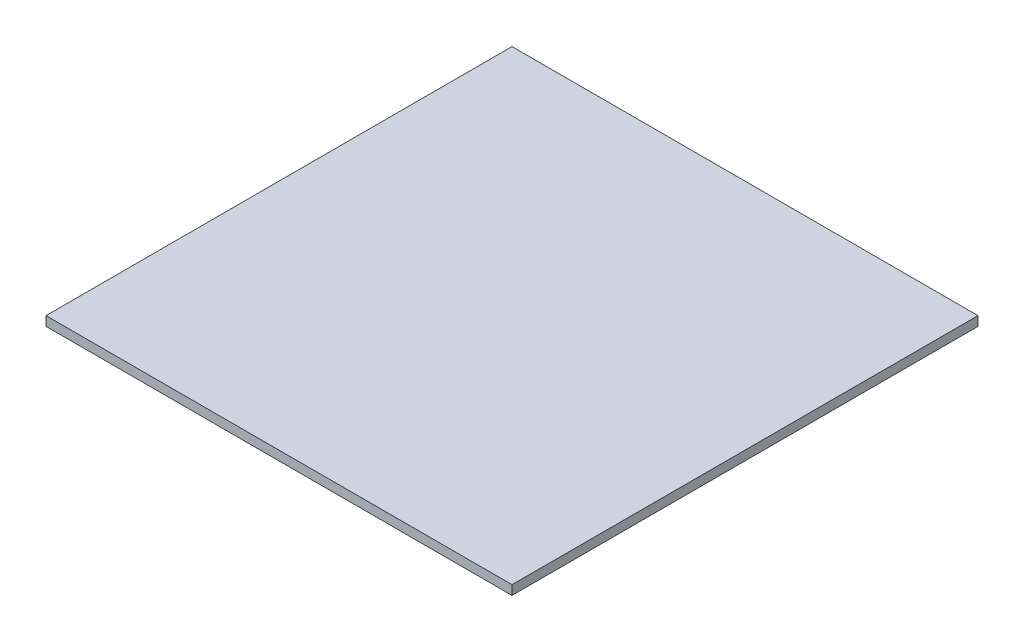
ISO-10303-21;
HEADER;
FILE_DESCRIPTION(('STEP AP214'),'2;1');
FILE_NAME('part.step','',(''),(''),'','','');
FILE_SCHEMA(('AUTOMOTIVE_DESIGN { 1 0 10303 214 1 1 1 1 }'));
ENDSEC;
DATA;
#1=APPLICATION_CONTEXT('core data for automotive mechanical design processes');
#2=APPLICATION_PROTOCOL_DEFINITION('international standard','automotive_design',2000,#1);
#3=PRODUCT_CONTEXT('',#1,'mechanical');
#4=PRODUCT('Part','Part','',(#3));
#5=PRODUCT_RELATED_PRODUCT_CATEGORY('part','',(#4));
#6=PRODUCT_DEFINITION_FORMATION('','',#4);
#7=PRODUCT_DEFINITION_CONTEXT('part definition',#1,'design');
#8=PRODUCT_DEFINITION('design','',#6,#7);
#9=PRODUCT_DEFINITION_SHAPE('','',#8);
#10=(LENGTH_UNIT() NAMED_UNIT(*) SI_UNIT(.MILLI.,.METRE.));
#11=(NAMED_UNIT(*) PLANE_ANGLE_UNIT() SI_UNIT($,.RADIAN.));
#12=(NAMED_UNIT(*) SI_UNIT($,.STERADIAN.) SOLID_ANGLE_UNIT());
#13=UNCERTAINTY_MEASURE_WITH_UNIT(LENGTH_MEASURE(1.E-05),#10,'distance_accuracy_value','');
#14=(GEOMETRIC_REPRESENTATION_CONTEXT(3) GLOBAL_UNCERTAINTY_ASSIGNED_CONTEXT((#13)) GLOBAL_UNIT_ASSIGNED_CONTEXT((#10,
#11,#12)) REPRESENTATION_CONTEXT('',''));
#15=CARTESIAN_POINT('',(0.,0.,0.));
#16=DIRECTION('',(0.,0.,1.));
#17=DIRECTION('',(1.,0.,0.));
#18=AXIS2_PLACEMENT_3D('',#15,#16,#17);
#19=CARTESIAN_POINT('',(250.,10.,250.));
#20=DIRECTION('',(-1.,0.,0.));
#21=DIRECTION('',(0.,0.,1.));
#22=AXIS2_PLACEMENT_3D('',#19,#20,#21);
#23=PLANE('',#22);
#24=DIRECTION('',(0.,0.,-1.));
#25=VECTOR('',#24,1.);
#26=CARTESIAN_POINT('',(250.,0.,250.));
#27=LINE('',#26,#25);
#28=CARTESIAN_POINT('',(250.,0.,250.));
#29=VERTEX_POINT('',#28);
#30=CARTESIAN_POINT('',(250.,0.,-250.));
#31=VERTEX_POINT('',#30);
#32=EDGE_CURVE('E99',#29,#31,#27,.T.);
#33=ORIENTED_EDGE('',*,*,#32,.T.);
#34=DIRECTION('',(0.,-1.,0.));
#35=VECTOR('',#34,1.);
#36=CARTESIAN_POINT('',(250.,10.,-250.));
#37=LINE('',#36,#35);
#38=CARTESIAN_POINT('',(250.,10.,-250.));
#39=VERTEX_POINT('',#38);
#40=EDGE_CURVE('E11',#39,#31,#37,.T.);
#41=ORIENTED_EDGE('',*,*,#40,.F.);
#42=DIRECTION('',(0.,0.,-1.));
#43=VECTOR('',#42,1.);
#44=CARTESIAN_POINT('',(250.,10.,250.));
#45=LINE('',#44,#43);
#46=CARTESIAN_POINT('',(250.,10.,250.));
#47=VERTEX_POINT('',#46);
#48=EDGE_CURVE('E87',#47,#39,#45,.T.);
#49=ORIENTED_EDGE('',*,*,#48,.F.);
#50=DIRECTION('',(0.,-1.,0.));
#51=VECTOR('',#50,1.);
#52=CARTESIAN_POINT('',(250.,10.,250.));
#53=LINE('',#52,#51);
#54=EDGE_CURVE('E95',#47,#29,#53,.T.);
#55=ORIENTED_EDGE('',*,*,#54,.T.);
#56=EDGE_LOOP('',(#33,#41,#49,#55));
#57=FACE_BOUND('',#56,.T.);
#58=ADVANCED_FACE('F36',(#57),#23,.F.);
#59=CARTESIAN_POINT('',(-250.,10.,-250.));
#60=DIRECTION('',(0.,0.,1.));
#61=DIRECTION('',(1.,0.,0.));
#62=AXIS2_PLACEMENT_3D('',#59,#60,#61);
#63=PLANE('',#62);
#64=DIRECTION('',(-1.,0.,0.));
#65=VECTOR('',#64,1.);
#66=CARTESIAN_POINT('',(-250.,0.,-250.));
#67=LINE('',#66,#65);
#68=CARTESIAN_POINT('',(-250.,0.,-250.));
#69=VERTEX_POINT('',#68);
#70=EDGE_CURVE('E91',#31,#69,#67,.T.);
#71=ORIENTED_EDGE('',*,*,#70,.T.);
#72=DIRECTION('',(0.,-1.,0.));
#73=VECTOR('',#72,1.);
#74=CARTESIAN_POINT('',(-250.,10.,-250.));
#75=LINE('',#74,#73);
#76=CARTESIAN_POINT('',(-250.,10.,-250.));
#77=VERTEX_POINT('',#76);
#78=EDGE_CURVE('E44',#77,#69,#75,.T.);
#79=ORIENTED_EDGE('',*,*,#78,.F.);
#80=DIRECTION('',(-1.,0.,0.));
#81=VECTOR('',#80,1.);
#82=CARTESIAN_POINT('',(-250.,10.,-250.));
#83=LINE('',#82,#81);
#84=EDGE_CURVE('E82',#39,#77,#83,.T.);
#85=ORIENTED_EDGE('',*,*,#84,.F.);
#86=ORIENTED_EDGE('',*,*,#40,.T.);
#87=EDGE_LOOP('',(#71,#79,#85,#86));
#88=FACE_BOUND('',#87,.T.);
#89=ADVANCED_FACE('F90',(#88),#63,.F.);
#90=CARTESIAN_POINT('',(-250.,10.,250.));
#91=DIRECTION('',(1.,0.,0.));
#92=DIRECTION('',(0.,0.,-1.));
#93=AXIS2_PLACEMENT_3D('',#90,#91,#92);
#94=PLANE('',#93);
#95=DIRECTION('',(0.,0.,1.));
#96=VECTOR('',#95,1.);
#97=CARTESIAN_POINT('',(-250.,0.,250.));
#98=LINE('',#97,#96);
#99=CARTESIAN_POINT('',(-250.,0.,250.));
#100=VERTEX_POINT('',#99);
#101=EDGE_CURVE('E69',#69,#100,#98,.T.);
#102=ORIENTED_EDGE('',*,*,#101,.T.);
#103=DIRECTION('',(0.,-1.,0.));
#104=VECTOR('',#103,1.);
#105=CARTESIAN_POINT('',(-250.,10.,250.));
#106=LINE('',#105,#104);
#107=CARTESIAN_POINT('',(-250.,10.,250.));
#108=VERTEX_POINT('',#107);
#109=EDGE_CURVE('E92',#108,#100,#106,.T.);
#110=ORIENTED_EDGE('',*,*,#109,.F.);
#111=DIRECTION('',(0.,0.,1.));
#112=VECTOR('',#111,1.);
#113=CARTESIAN_POINT('',(-250.,10.,250.));
#114=LINE('',#113,#112);
#115=EDGE_CURVE('E85',#77,#108,#114,.T.);
#116=ORIENTED_EDGE('',*,*,#115,.F.);
#117=ORIENTED_EDGE('',*,*,#78,.T.);
#118=EDGE_LOOP('',(#102,#110,#116,#117));
#119=FACE_BOUND('',#118,.T.);
#120=ADVANCED_FACE('F93',(#119),#94,.F.);
#121=CARTESIAN_POINT('',(-250.,10.,250.));
#122=DIRECTION('',(0.,0.,-1.));
#123=DIRECTION('',(-1.,0.,0.));
#124=AXIS2_PLACEMENT_3D('',#121,#122,#123);
#125=PLANE('',#124);
#126=DIRECTION('',(1.,0.,0.));
#127=VECTOR('',#126,1.);
#128=CARTESIAN_POINT('',(-250.,0.,250.));
#129=LINE('',#128,#127);
#130=EDGE_CURVE('E75',#100,#29,#129,.T.);
#131=ORIENTED_EDGE('',*,*,#130,.T.);
#132=ORIENTED_EDGE('',*,*,#54,.F.);
#133=DIRECTION('',(1.,0.,0.));
#134=VECTOR('',#133,1.);
#135=CARTESIAN_POINT('',(-250.,10.,250.));
#136=LINE('',#135,#134);
#137=EDGE_CURVE('E52',#108,#47,#136,.T.);
#138=ORIENTED_EDGE('',*,*,#137,.F.);
#139=ORIENTED_EDGE('',*,*,#109,.T.);
#140=EDGE_LOOP('',(#131,#132,#138,#139));
#141=FACE_BOUND('',#140,.T.);
#142=ADVANCED_FACE('F106',(#141),#125,.F.);
#143=CARTESIAN_POINT('',(0.,10.,0.));
#144=DIRECTION('',(0.,-1.,0.));
#145=DIRECTION('',(0.,0.,-1.));
#146=AXIS2_PLACEMENT_3D('',#143,#144,#145);
#147=PLANE('',#146);
#148=ORIENTED_EDGE('',*,*,#48,.T.);
#149=ORIENTED_EDGE('',*,*,#84,.T.);
#150=ORIENTED_EDGE('',*,*,#115,.T.);
#151=ORIENTED_EDGE('',*,*,#137,.T.);
#152=EDGE_LOOP('',(#148,#149,#150,#151));
#153=FACE_BOUND('',#152,.T.);
#154=ADVANCED_FACE('F83',(#153),#147,.F.);
#155=CARTESIAN_POINT('',(0.,0.,0.));
#156=DIRECTION('',(0.,-1.,0.));
#157=DIRECTION('',(0.,0.,-1.));
#158=AXIS2_PLACEMENT_3D('',#155,#156,#157);
#159=PLANE('',#158);
#160=ORIENTED_EDGE('',*,*,#32,.F.);
#161=ORIENTED_EDGE('',*,*,#130,.F.);
#162=ORIENTED_EDGE('',*,*,#101,.F.);
#163=ORIENTED_EDGE('',*,*,#70,.F.);
#164=EDGE_LOOP('',(#160,#161,#162,#163));
#165=FACE_BOUND('',#164,.T.);
#166=ADVANCED_FACE('F109',(#165),#159,.T.);
#167=CLOSED_SHELL('',(#58,#89,#120,#142,#154,#166));
#168=MANIFOLD_SOLID_BREP('B2',#167);
#169=ADVANCED_BREP_SHAPE_REPRESENTATION('',(#18,#168),#14);
#170=SHAPE_DEFINITION_REPRESENTATION(#9,#169);
ENDSEC;
END-ISO-10303-21;
